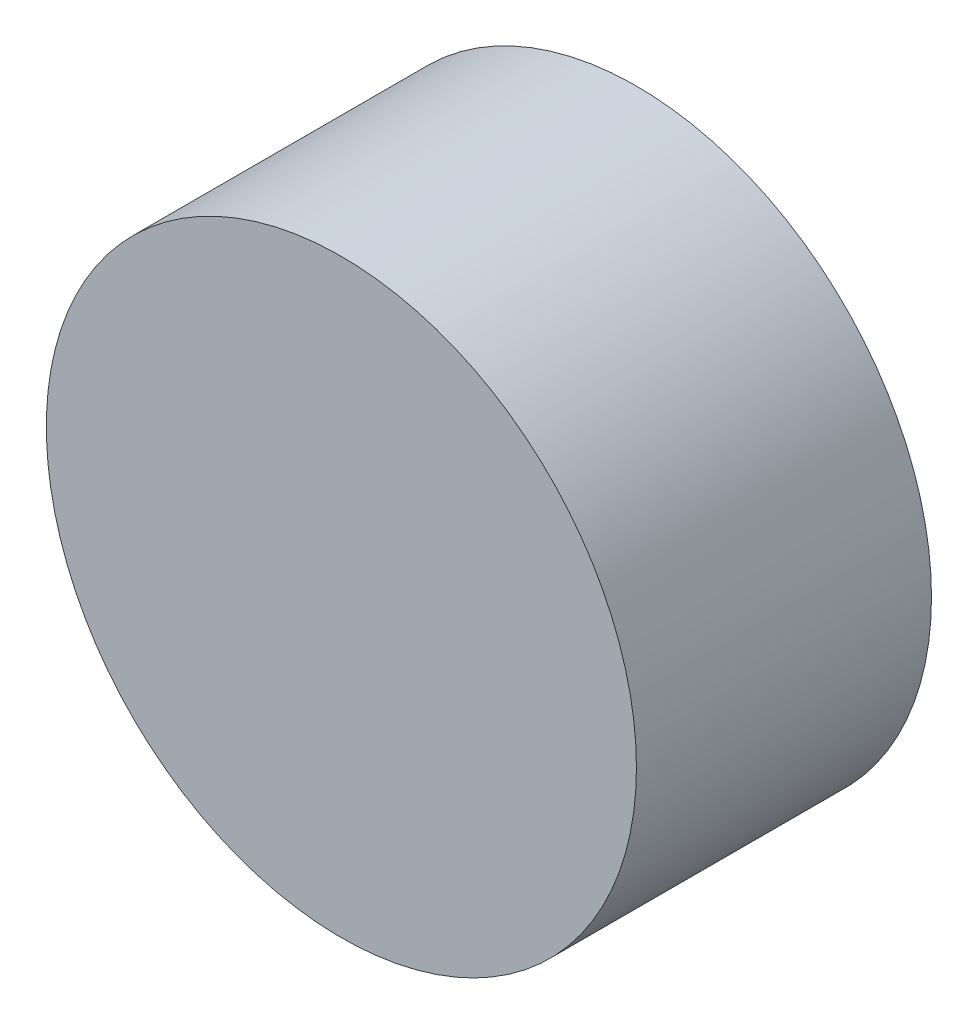
ISO-10303-21;
HEADER;
FILE_DESCRIPTION(('STEP AP214'),'2;1');
FILE_NAME('part.step','',(''),(''),'','','');
FILE_SCHEMA(('AUTOMOTIVE_DESIGN { 1 0 10303 214 1 1 1 1 }'));
ENDSEC;
DATA;
#1=APPLICATION_CONTEXT('core data for automotive mechanical design processes');
#2=APPLICATION_PROTOCOL_DEFINITION('international standard','automotive_design',2000,#1);
#3=PRODUCT_CONTEXT('',#1,'mechanical');
#4=PRODUCT('Part','Part','',(#3));
#5=PRODUCT_RELATED_PRODUCT_CATEGORY('part','',(#4));
#6=PRODUCT_DEFINITION_FORMATION('','',#4);
#7=PRODUCT_DEFINITION_CONTEXT('part definition',#1,'design');
#8=PRODUCT_DEFINITION('design','',#6,#7);
#9=PRODUCT_DEFINITION_SHAPE('','',#8);
#10=(LENGTH_UNIT() NAMED_UNIT(*) SI_UNIT(.MILLI.,.METRE.));
#11=(NAMED_UNIT(*) PLANE_ANGLE_UNIT() SI_UNIT($,.RADIAN.));
#12=(NAMED_UNIT(*) SI_UNIT($,.STERADIAN.) SOLID_ANGLE_UNIT());
#13=UNCERTAINTY_MEASURE_WITH_UNIT(LENGTH_MEASURE(1.E-05),#10,'distance_accuracy_value','');
#14=(GEOMETRIC_REPRESENTATION_CONTEXT(3) GLOBAL_UNCERTAINTY_ASSIGNED_CONTEXT((#13)) GLOBAL_UNIT_ASSIGNED_CONTEXT((#10,
#11,#12)) REPRESENTATION_CONTEXT('',''));
#15=CARTESIAN_POINT('',(0.,0.,0.));
#16=DIRECTION('',(0.,0.,1.));
#17=DIRECTION('',(1.,0.,0.));
#18=AXIS2_PLACEMENT_3D('',#15,#16,#17);
#19=CARTESIAN_POINT('',(0.,0.,3.));
#20=DIRECTION('',(0.,0.,-1.));
#21=DIRECTION('',(-1.,0.,0.));
#22=AXIS2_PLACEMENT_3D('',#19,#20,#21);
#23=CYLINDRICAL_SURFACE('',#22,3.);
#24=CARTESIAN_POINT('',(0.,0.,3.));
#25=DIRECTION('',(0.,0.,1.));
#26=DIRECTION('',(1.,0.,0.));
#27=AXIS2_PLACEMENT_3D('',#24,#25,#26);
#28=CIRCLE('',#27,3.);
#29=CARTESIAN_POINT('',(3.,0.,3.));
#30=VERTEX_POINT('',#29);
#31=EDGE_CURVE('E10',#30,#30,#28,.T.);
#32=ORIENTED_EDGE('',*,*,#31,.F.);
#33=EDGE_LOOP('',(#32));
#34=FACE_BOUND('',#33,.T.);
#35=CARTESIAN_POINT('',(0.,0.,0.));
#36=DIRECTION('',(0.,0.,1.));
#37=DIRECTION('',(1.,0.,0.));
#38=AXIS2_PLACEMENT_3D('',#35,#36,#37);
#39=CIRCLE('',#38,3.);
#40=CARTESIAN_POINT('',(3.,0.,0.));
#41=VERTEX_POINT('',#40);
#42=EDGE_CURVE('E40',#41,#41,#39,.T.);
#43=ORIENTED_EDGE('',*,*,#42,.T.);
#44=EDGE_LOOP('',(#43));
#45=FACE_BOUND('',#44,.T.);
#46=ADVANCED_FACE('F37',(#34,#45),#23,.T.);
#47=CARTESIAN_POINT('',(0.,0.,3.));
#48=DIRECTION('',(0.,0.,1.));
#49=DIRECTION('',(1.,0.,0.));
#50=AXIS2_PLACEMENT_3D('',#47,#48,#49);
#51=PLANE('',#50);
#52=ORIENTED_EDGE('',*,*,#31,.T.);
#53=EDGE_LOOP('',(#52));
#54=FACE_BOUND('',#53,.T.);
#55=ADVANCED_FACE('F52',(#54),#51,.T.);
#56=CARTESIAN_POINT('',(0.,0.,0.));
#57=DIRECTION('',(0.,0.,1.));
#58=DIRECTION('',(1.,0.,0.));
#59=AXIS2_PLACEMENT_3D('',#56,#57,#58);
#60=PLANE('',#59);
#61=ORIENTED_EDGE('',*,*,#42,.F.);
#62=EDGE_LOOP('',(#61));
#63=FACE_BOUND('',#62,.T.);
#64=ADVANCED_FACE('F50',(#63),#60,.F.);
#65=CLOSED_SHELL('',(#46,#55,#64));
#66=MANIFOLD_SOLID_BREP('B2',#65);
#67=ADVANCED_BREP_SHAPE_REPRESENTATION('',(#18,#66),#14);
#68=SHAPE_DEFINITION_REPRESENTATION(#9,#67);
ENDSEC;
END-ISO-10303-21;
